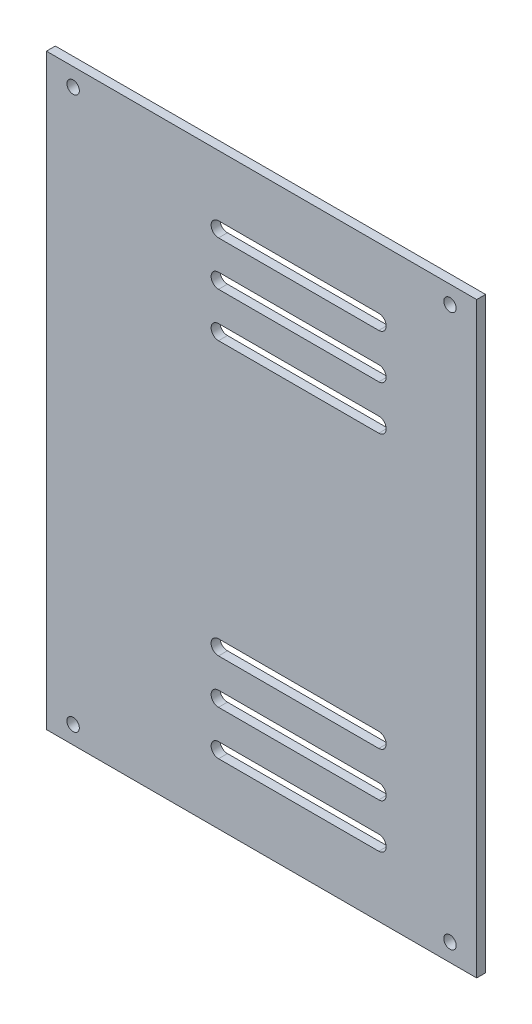
ISO-10303-21;
HEADER;
FILE_DESCRIPTION(('STEP AP214'),'2;1');
FILE_NAME('part.step','',(''),(''),'','','');
FILE_SCHEMA(('AUTOMOTIVE_DESIGN { 1 0 10303 214 1 1 1 1 }'));
ENDSEC;
DATA;
#1=APPLICATION_CONTEXT('core data for automotive mechanical design processes');
#2=APPLICATION_PROTOCOL_DEFINITION('international standard','automotive_design',2000,#1);
#3=PRODUCT_CONTEXT('',#1,'mechanical');
#4=PRODUCT('Part','Part','',(#3));
#5=PRODUCT_RELATED_PRODUCT_CATEGORY('part','',(#4));
#6=PRODUCT_DEFINITION_FORMATION('','',#4);
#7=PRODUCT_DEFINITION_CONTEXT('part definition',#1,'design');
#8=PRODUCT_DEFINITION('design','',#6,#7);
#9=PRODUCT_DEFINITION_SHAPE('','',#8);
#10=(LENGTH_UNIT() NAMED_UNIT(*) SI_UNIT(.MILLI.,.METRE.));
#11=(NAMED_UNIT(*) PLANE_ANGLE_UNIT() SI_UNIT($,.RADIAN.));
#12=(NAMED_UNIT(*) SI_UNIT($,.STERADIAN.) SOLID_ANGLE_UNIT());
#13=UNCERTAINTY_MEASURE_WITH_UNIT(LENGTH_MEASURE(1.E-05),#10,'distance_accuracy_value','');
#14=(GEOMETRIC_REPRESENTATION_CONTEXT(3) GLOBAL_UNCERTAINTY_ASSIGNED_CONTEXT((#13)) GLOBAL_UNIT_ASSIGNED_CONTEXT((#10,
#11,#12)) REPRESENTATION_CONTEXT('',''));
#15=CARTESIAN_POINT('',(0.,0.,0.));
#16=DIRECTION('',(0.,0.,1.));
#17=DIRECTION('',(1.,0.,0.));
#18=AXIS2_PLACEMENT_3D('',#15,#16,#17);
#19=CARTESIAN_POINT('',(0.,0.,3.));
#20=DIRECTION('',(0.,0.,1.));
#21=DIRECTION('',(1.,0.,0.));
#22=AXIS2_PLACEMENT_3D('',#19,#20,#21);
#23=PLANE('',#22);
#24=CARTESIAN_POINT('',(45.,-93.,3.));
#25=DIRECTION('',(0.,0.,1.));
#26=DIRECTION('',(1.,0.,0.));
#27=AXIS2_PLACEMENT_3D('',#24,#25,#26);
#28=CIRCLE('',#27,2.1);
#29=CARTESIAN_POINT('',(47.1,-93.,3.));
#30=VERTEX_POINT('',#29);
#31=EDGE_CURVE('E502',#30,#30,#28,.T.);
#32=ORIENTED_EDGE('',*,*,#31,.F.);
#33=EDGE_LOOP('',(#32));
#34=FACE_BOUND('',#33,.T.);
#35=CARTESIAN_POINT('',(-82.,-93.,3.));
#36=DIRECTION('',(0.,0.,1.));
#37=DIRECTION('',(1.,0.,0.));
#38=AXIS2_PLACEMENT_3D('',#35,#36,#37);
#39=CIRCLE('',#38,2.1);
#40=CARTESIAN_POINT('',(-79.9,-93.,3.));
#41=VERTEX_POINT('',#40);
#42=EDGE_CURVE('E518',#41,#41,#39,.T.);
#43=ORIENTED_EDGE('',*,*,#42,.F.);
#44=EDGE_LOOP('',(#43));
#45=FACE_BOUND('',#44,.T.);
#46=DIRECTION('',(0.,-1.,0.));
#47=VECTOR('',#46,1.);
#48=CARTESIAN_POINT('',(-91.,99.,3.));
#49=LINE('',#48,#47);
#50=CARTESIAN_POINT('',(-91.,99.,3.));
#51=VERTEX_POINT('',#50);
#52=CARTESIAN_POINT('',(-91.,-99.,3.));
#53=VERTEX_POINT('',#52);
#54=EDGE_CURVE('E526',#51,#53,#49,.T.);
#55=ORIENTED_EDGE('',*,*,#54,.T.);
#56=DIRECTION('',(1.,0.,0.));
#57=VECTOR('',#56,1.);
#58=CARTESIAN_POINT('',(-91.,-99.,3.));
#59=LINE('',#58,#57);
#60=CARTESIAN_POINT('',(54.,-99.,3.));
#61=VERTEX_POINT('',#60);
#62=EDGE_CURVE('E530',#53,#61,#59,.T.);
#63=ORIENTED_EDGE('',*,*,#62,.T.);
#64=DIRECTION('',(0.,1.,0.));
#65=VECTOR('',#64,1.);
#66=CARTESIAN_POINT('',(54.,-99.,3.));
#67=LINE('',#66,#65);
#68=CARTESIAN_POINT('',(54.,99.,3.));
#69=VERTEX_POINT('',#68);
#70=EDGE_CURVE('E534',#61,#69,#67,.T.);
#71=ORIENTED_EDGE('',*,*,#70,.T.);
#72=DIRECTION('',(-1.,0.,0.));
#73=VECTOR('',#72,1.);
#74=CARTESIAN_POINT('',(54.,99.,3.));
#75=LINE('',#74,#73);
#76=EDGE_CURVE('E537',#69,#51,#75,.T.);
#77=ORIENTED_EDGE('',*,*,#76,.T.);
#78=EDGE_LOOP('',(#55,#63,#71,#77));
#79=FACE_BOUND('',#78,.T.);
#80=CARTESIAN_POINT('',(-82.,93.,3.));
#81=DIRECTION('',(0.,0.,1.));
#82=DIRECTION('',(1.,0.,0.));
#83=AXIS2_PLACEMENT_3D('',#80,#81,#82);
#84=CIRCLE('',#83,2.1);
#85=CARTESIAN_POINT('',(-79.9,93.,3.));
#86=VERTEX_POINT('',#85);
#87=EDGE_CURVE('E510',#86,#86,#84,.T.);
#88=ORIENTED_EDGE('',*,*,#87,.F.);
#89=EDGE_LOOP('',(#88));
#90=FACE_BOUND('',#89,.T.);
#91=CARTESIAN_POINT('',(45.,93.,3.));
#92=DIRECTION('',(0.,0.,1.));
#93=DIRECTION('',(1.,0.,0.));
#94=AXIS2_PLACEMENT_3D('',#91,#92,#93);
#95=CIRCLE('',#94,2.1);
#96=CARTESIAN_POINT('',(47.1,93.,3.));
#97=VERTEX_POINT('',#96);
#98=EDGE_CURVE('E494',#97,#97,#95,.T.);
#99=ORIENTED_EDGE('',*,*,#98,.F.);
#100=EDGE_LOOP('',(#99));
#101=FACE_BOUND('',#100,.T.);
#102=DIRECTION('',(1.,0.,0.));
#103=VECTOR('',#102,1.);
#104=CARTESIAN_POINT('',(-33.,-78.5,3.));
#105=LINE('',#104,#103);
#106=CARTESIAN_POINT('',(-33.,-78.5,3.));
#107=VERTEX_POINT('',#106);
#108=CARTESIAN_POINT('',(21.,-78.5,3.));
#109=VERTEX_POINT('',#108);
#110=EDGE_CURVE('E454',#107,#109,#105,.T.);
#111=ORIENTED_EDGE('',*,*,#110,.F.);
#112=CARTESIAN_POINT('',(-33.,-76.,3.));
#113=DIRECTION('',(0.,0.,1.));
#114=DIRECTION('',(1.,0.,0.));
#115=AXIS2_PLACEMENT_3D('',#112,#113,#114);
#116=CIRCLE('',#115,2.5);
#117=CARTESIAN_POINT('',(-33.,-73.5,3.));
#118=VERTEX_POINT('',#117);
#119=EDGE_CURVE('E451',#118,#107,#116,.T.);
#120=ORIENTED_EDGE('',*,*,#119,.F.);
#121=DIRECTION('',(-1.,0.,0.));
#122=VECTOR('',#121,1.);
#123=CARTESIAN_POINT('',(21.,-73.5,3.));
#124=LINE('',#123,#122);
#125=CARTESIAN_POINT('',(21.,-73.5,3.));
#126=VERTEX_POINT('',#125);
#127=EDGE_CURVE('E462',#126,#118,#124,.T.);
#128=ORIENTED_EDGE('',*,*,#127,.F.);
#129=CARTESIAN_POINT('',(21.,-76.,3.));
#130=DIRECTION('',(0.,0.,1.));
#131=DIRECTION('',(1.,0.,0.));
#132=AXIS2_PLACEMENT_3D('',#129,#130,#131);
#133=CIRCLE('',#132,2.5);
#134=EDGE_CURVE('E458',#109,#126,#133,.T.);
#135=ORIENTED_EDGE('',*,*,#134,.F.);
#136=EDGE_LOOP('',(#111,#120,#128,#135));
#137=FACE_BOUND('',#136,.T.);
#138=DIRECTION('',(1.,0.,0.));
#139=VECTOR('',#138,1.);
#140=CARTESIAN_POINT('',(-33.,-63.5,3.));
#141=LINE('',#140,#139);
#142=CARTESIAN_POINT('',(-33.,-63.5,3.));
#143=VERTEX_POINT('',#142);
#144=CARTESIAN_POINT('',(21.,-63.5,3.));
#145=VERTEX_POINT('',#144);
#146=EDGE_CURVE('E411',#143,#145,#141,.T.);
#147=ORIENTED_EDGE('',*,*,#146,.F.);
#148=CARTESIAN_POINT('',(-33.,-61.,3.));
#149=DIRECTION('',(0.,0.,1.));
#150=DIRECTION('',(1.,0.,0.));
#151=AXIS2_PLACEMENT_3D('',#148,#149,#150);
#152=CIRCLE('',#151,2.5);
#153=CARTESIAN_POINT('',(-33.,-58.5,3.));
#154=VERTEX_POINT('',#153);
#155=EDGE_CURVE('E408',#154,#143,#152,.T.);
#156=ORIENTED_EDGE('',*,*,#155,.F.);
#157=DIRECTION('',(-1.,0.,0.));
#158=VECTOR('',#157,1.);
#159=CARTESIAN_POINT('',(21.,-58.5,3.));
#160=LINE('',#159,#158);
#161=CARTESIAN_POINT('',(21.,-58.5,3.));
#162=VERTEX_POINT('',#161);
#163=EDGE_CURVE('E419',#162,#154,#160,.T.);
#164=ORIENTED_EDGE('',*,*,#163,.F.);
#165=CARTESIAN_POINT('',(21.,-61.,3.));
#166=DIRECTION('',(0.,0.,1.));
#167=DIRECTION('',(1.,0.,0.));
#168=AXIS2_PLACEMENT_3D('',#165,#166,#167);
#169=CIRCLE('',#168,2.5);
#170=EDGE_CURVE('E415',#145,#162,#169,.T.);
#171=ORIENTED_EDGE('',*,*,#170,.F.);
#172=EDGE_LOOP('',(#147,#156,#164,#171));
#173=FACE_BOUND('',#172,.T.);
#174=DIRECTION('',(1.,0.,0.));
#175=VECTOR('',#174,1.);
#176=CARTESIAN_POINT('',(-33.,-48.5,3.));
#177=LINE('',#176,#175);
#178=CARTESIAN_POINT('',(-33.,-48.5,3.));
#179=VERTEX_POINT('',#178);
#180=CARTESIAN_POINT('',(21.,-48.5,3.));
#181=VERTEX_POINT('',#180);
#182=EDGE_CURVE('E368',#179,#181,#177,.T.);
#183=ORIENTED_EDGE('',*,*,#182,.F.);
#184=CARTESIAN_POINT('',(-33.,-46.,3.));
#185=DIRECTION('',(0.,0.,1.));
#186=DIRECTION('',(1.,0.,0.));
#187=AXIS2_PLACEMENT_3D('',#184,#185,#186);
#188=CIRCLE('',#187,2.5);
#189=CARTESIAN_POINT('',(-33.,-43.5,3.));
#190=VERTEX_POINT('',#189);
#191=EDGE_CURVE('E365',#190,#179,#188,.T.);
#192=ORIENTED_EDGE('',*,*,#191,.F.);
#193=DIRECTION('',(-1.,0.,0.));
#194=VECTOR('',#193,1.);
#195=CARTESIAN_POINT('',(21.,-43.5,3.));
#196=LINE('',#195,#194);
#197=CARTESIAN_POINT('',(21.,-43.5,3.));
#198=VERTEX_POINT('',#197);
#199=EDGE_CURVE('E376',#198,#190,#196,.T.);
#200=ORIENTED_EDGE('',*,*,#199,.F.);
#201=CARTESIAN_POINT('',(21.,-46.,3.));
#202=DIRECTION('',(0.,0.,1.));
#203=DIRECTION('',(1.,0.,0.));
#204=AXIS2_PLACEMENT_3D('',#201,#202,#203);
#205=CIRCLE('',#204,2.5);
#206=EDGE_CURVE('E372',#181,#198,#205,.T.);
#207=ORIENTED_EDGE('',*,*,#206,.F.);
#208=EDGE_LOOP('',(#183,#192,#200,#207));
#209=FACE_BOUND('',#208,.T.);
#210=DIRECTION('',(1.,0.,0.));
#211=VECTOR('',#210,1.);
#212=CARTESIAN_POINT('',(-33.,43.5,3.));
#213=LINE('',#212,#211);
#214=CARTESIAN_POINT('',(-33.,43.5,3.));
#215=VERTEX_POINT('',#214);
#216=CARTESIAN_POINT('',(21.,43.5,3.));
#217=VERTEX_POINT('',#216);
#218=EDGE_CURVE('E325',#215,#217,#213,.T.);
#219=ORIENTED_EDGE('',*,*,#218,.F.);
#220=CARTESIAN_POINT('',(-33.,46.,3.));
#221=DIRECTION('',(0.,0.,1.));
#222=DIRECTION('',(1.,0.,0.));
#223=AXIS2_PLACEMENT_3D('',#220,#221,#222);
#224=CIRCLE('',#223,2.5);
#225=CARTESIAN_POINT('',(-33.,48.5,3.));
#226=VERTEX_POINT('',#225);
#227=EDGE_CURVE('E322',#226,#215,#224,.T.);
#228=ORIENTED_EDGE('',*,*,#227,.F.);
#229=DIRECTION('',(-1.,0.,0.));
#230=VECTOR('',#229,1.);
#231=CARTESIAN_POINT('',(21.,48.5,3.));
#232=LINE('',#231,#230);
#233=CARTESIAN_POINT('',(21.,48.5,3.));
#234=VERTEX_POINT('',#233);
#235=EDGE_CURVE('E333',#234,#226,#232,.T.);
#236=ORIENTED_EDGE('',*,*,#235,.F.);
#237=CARTESIAN_POINT('',(21.,46.,3.));
#238=DIRECTION('',(0.,0.,1.));
#239=DIRECTION('',(1.,0.,0.));
#240=AXIS2_PLACEMENT_3D('',#237,#238,#239);
#241=CIRCLE('',#240,2.5);
#242=EDGE_CURVE('E329',#217,#234,#241,.T.);
#243=ORIENTED_EDGE('',*,*,#242,.F.);
#244=EDGE_LOOP('',(#219,#228,#236,#243));
#245=FACE_BOUND('',#244,.T.);
#246=DIRECTION('',(1.,0.,0.));
#247=VECTOR('',#246,1.);
#248=CARTESIAN_POINT('',(-33.,58.5,3.));
#249=LINE('',#248,#247);
#250=CARTESIAN_POINT('',(-33.,58.5,3.));
#251=VERTEX_POINT('',#250);
#252=CARTESIAN_POINT('',(21.,58.5,3.));
#253=VERTEX_POINT('',#252);
#254=EDGE_CURVE('E282',#251,#253,#249,.T.);
#255=ORIENTED_EDGE('',*,*,#254,.F.);
#256=CARTESIAN_POINT('',(-33.,61.,3.));
#257=DIRECTION('',(0.,0.,1.));
#258=DIRECTION('',(1.,0.,0.));
#259=AXIS2_PLACEMENT_3D('',#256,#257,#258);
#260=CIRCLE('',#259,2.5);
#261=CARTESIAN_POINT('',(-33.,63.5,3.));
#262=VERTEX_POINT('',#261);
#263=EDGE_CURVE('E279',#262,#251,#260,.T.);
#264=ORIENTED_EDGE('',*,*,#263,.F.);
#265=DIRECTION('',(-1.,0.,0.));
#266=VECTOR('',#265,1.);
#267=CARTESIAN_POINT('',(21.,63.5,3.));
#268=LINE('',#267,#266);
#269=CARTESIAN_POINT('',(21.,63.5,3.));
#270=VERTEX_POINT('',#269);
#271=EDGE_CURVE('E290',#270,#262,#268,.T.);
#272=ORIENTED_EDGE('',*,*,#271,.F.);
#273=CARTESIAN_POINT('',(21.,61.,3.));
#274=DIRECTION('',(0.,0.,1.));
#275=DIRECTION('',(1.,0.,0.));
#276=AXIS2_PLACEMENT_3D('',#273,#274,#275);
#277=CIRCLE('',#276,2.5);
#278=EDGE_CURVE('E286',#253,#270,#277,.T.);
#279=ORIENTED_EDGE('',*,*,#278,.F.);
#280=EDGE_LOOP('',(#255,#264,#272,#279));
#281=FACE_BOUND('',#280,.T.);
#282=DIRECTION('',(1.,0.,0.));
#283=VECTOR('',#282,1.);
#284=CARTESIAN_POINT('',(-33.,73.5,3.));
#285=LINE('',#284,#283);
#286=CARTESIAN_POINT('',(-33.,73.5,3.));
#287=VERTEX_POINT('',#286);
#288=CARTESIAN_POINT('',(21.,73.5,3.));
#289=VERTEX_POINT('',#288);
#290=EDGE_CURVE('E240',#287,#289,#285,.T.);
#291=ORIENTED_EDGE('',*,*,#290,.F.);
#292=CARTESIAN_POINT('',(-33.,76.,3.));
#293=DIRECTION('',(0.,0.,1.));
#294=DIRECTION('',(1.,0.,0.));
#295=AXIS2_PLACEMENT_3D('',#292,#293,#294);
#296=CIRCLE('',#295,2.5);
#297=CARTESIAN_POINT('',(-33.,78.5,3.));
#298=VERTEX_POINT('',#297);
#299=EDGE_CURVE('E231',#298,#287,#296,.T.);
#300=ORIENTED_EDGE('',*,*,#299,.F.);
#301=DIRECTION('',(-1.,0.,0.));
#302=VECTOR('',#301,1.);
#303=CARTESIAN_POINT('',(21.,78.5,3.));
#304=LINE('',#303,#302);
#305=CARTESIAN_POINT('',(21.,78.5,3.));
#306=VERTEX_POINT('',#305);
#307=EDGE_CURVE('E258',#306,#298,#304,.T.);
#308=ORIENTED_EDGE('',*,*,#307,.F.);
#309=CARTESIAN_POINT('',(21.,76.,3.));
#310=DIRECTION('',(0.,0.,1.));
#311=DIRECTION('',(1.,0.,0.));
#312=AXIS2_PLACEMENT_3D('',#309,#310,#311);
#313=CIRCLE('',#312,2.5);
#314=EDGE_CURVE('E253',#289,#306,#313,.T.);
#315=ORIENTED_EDGE('',*,*,#314,.F.);
#316=EDGE_LOOP('',(#291,#300,#308,#315));
#317=FACE_BOUND('',#316,.T.);
#318=ADVANCED_FACE('F45',(#34,#45,#79,#90,#101,#137,#173,#209,#245,#281,#317),#23,.T.);
#319=CARTESIAN_POINT('',(0.,0.,0.));
#320=DIRECTION('',(0.,0.,1.));
#321=DIRECTION('',(1.,0.,0.));
#322=AXIS2_PLACEMENT_3D('',#319,#320,#321);
#323=PLANE('',#322);
#324=CARTESIAN_POINT('',(-33.,61.,0.));
#325=DIRECTION('',(0.,0.,1.));
#326=DIRECTION('',(1.,0.,0.));
#327=AXIS2_PLACEMENT_3D('',#324,#325,#326);
#328=CIRCLE('',#327,2.5);
#329=CARTESIAN_POINT('',(-33.,63.5,0.));
#330=VERTEX_POINT('',#329);
#331=CARTESIAN_POINT('',(-33.,58.5,0.));
#332=VERTEX_POINT('',#331);
#333=EDGE_CURVE('E249',#330,#332,#328,.T.);
#334=ORIENTED_EDGE('',*,*,#333,.T.);
#335=DIRECTION('',(1.,0.,0.));
#336=VECTOR('',#335,1.);
#337=CARTESIAN_POINT('',(-33.,58.5,0.));
#338=LINE('',#337,#336);
#339=CARTESIAN_POINT('',(21.,58.5,0.));
#340=VERTEX_POINT('',#339);
#341=EDGE_CURVE('E297',#332,#340,#338,.T.);
#342=ORIENTED_EDGE('',*,*,#341,.T.);
#343=CARTESIAN_POINT('',(21.,61.,0.));
#344=DIRECTION('',(0.,0.,1.));
#345=DIRECTION('',(1.,0.,0.));
#346=AXIS2_PLACEMENT_3D('',#343,#344,#345);
#347=CIRCLE('',#346,2.5);
#348=CARTESIAN_POINT('',(21.,63.5,0.));
#349=VERTEX_POINT('',#348);
#350=EDGE_CURVE('E301',#340,#349,#347,.T.);
#351=ORIENTED_EDGE('',*,*,#350,.T.);
#352=DIRECTION('',(-1.,0.,0.));
#353=VECTOR('',#352,1.);
#354=CARTESIAN_POINT('',(21.,63.5,0.));
#355=LINE('',#354,#353);
#356=EDGE_CURVE('E283',#349,#330,#355,.T.);
#357=ORIENTED_EDGE('',*,*,#356,.T.);
#358=EDGE_LOOP('',(#334,#342,#351,#357));
#359=FACE_BOUND('',#358,.T.);
#360=CARTESIAN_POINT('',(-33.,-46.,0.));
#361=DIRECTION('',(0.,0.,1.));
#362=DIRECTION('',(1.,0.,0.));
#363=AXIS2_PLACEMENT_3D('',#360,#361,#362);
#364=CIRCLE('',#363,2.5);
#365=CARTESIAN_POINT('',(-33.,-43.5,0.));
#366=VERTEX_POINT('',#365);
#367=CARTESIAN_POINT('',(-33.,-48.5,0.));
#368=VERTEX_POINT('',#367);
#369=EDGE_CURVE('E364',#366,#368,#364,.T.);
#370=ORIENTED_EDGE('',*,*,#369,.T.);
#371=DIRECTION('',(1.,0.,0.));
#372=VECTOR('',#371,1.);
#373=CARTESIAN_POINT('',(-33.,-48.5,0.));
#374=LINE('',#373,#372);
#375=CARTESIAN_POINT('',(21.,-48.5,0.));
#376=VERTEX_POINT('',#375);
#377=EDGE_CURVE('E383',#368,#376,#374,.T.);
#378=ORIENTED_EDGE('',*,*,#377,.T.);
#379=CARTESIAN_POINT('',(21.,-46.,0.));
#380=DIRECTION('',(0.,0.,1.));
#381=DIRECTION('',(1.,0.,0.));
#382=AXIS2_PLACEMENT_3D('',#379,#380,#381);
#383=CIRCLE('',#382,2.5);
#384=CARTESIAN_POINT('',(21.,-43.5,0.));
#385=VERTEX_POINT('',#384);
#386=EDGE_CURVE('E387',#376,#385,#383,.T.);
#387=ORIENTED_EDGE('',*,*,#386,.T.);
#388=DIRECTION('',(-1.,0.,0.));
#389=VECTOR('',#388,1.);
#390=CARTESIAN_POINT('',(21.,-43.5,0.));
#391=LINE('',#390,#389);
#392=EDGE_CURVE('E369',#385,#366,#391,.T.);
#393=ORIENTED_EDGE('',*,*,#392,.T.);
#394=EDGE_LOOP('',(#370,#378,#387,#393));
#395=FACE_BOUND('',#394,.T.);
#396=CARTESIAN_POINT('',(-33.,-76.,0.));
#397=DIRECTION('',(0.,0.,1.));
#398=DIRECTION('',(1.,0.,0.));
#399=AXIS2_PLACEMENT_3D('',#396,#397,#398);
#400=CIRCLE('',#399,2.5);
#401=CARTESIAN_POINT('',(-33.,-73.5,0.));
#402=VERTEX_POINT('',#401);
#403=CARTESIAN_POINT('',(-33.,-78.5,0.));
#404=VERTEX_POINT('',#403);
#405=EDGE_CURVE('E450',#402,#404,#400,.T.);
#406=ORIENTED_EDGE('',*,*,#405,.T.);
#407=DIRECTION('',(1.,0.,0.));
#408=VECTOR('',#407,1.);
#409=CARTESIAN_POINT('',(-33.,-78.5,0.));
#410=LINE('',#409,#408);
#411=CARTESIAN_POINT('',(21.,-78.5,0.));
#412=VERTEX_POINT('',#411);
#413=EDGE_CURVE('E469',#404,#412,#410,.T.);
#414=ORIENTED_EDGE('',*,*,#413,.T.);
#415=CARTESIAN_POINT('',(21.,-76.,0.));
#416=DIRECTION('',(0.,0.,1.));
#417=DIRECTION('',(1.,0.,0.));
#418=AXIS2_PLACEMENT_3D('',#415,#416,#417);
#419=CIRCLE('',#418,2.5);
#420=CARTESIAN_POINT('',(21.,-73.5,0.));
#421=VERTEX_POINT('',#420);
#422=EDGE_CURVE('E473',#412,#421,#419,.T.);
#423=ORIENTED_EDGE('',*,*,#422,.T.);
#424=DIRECTION('',(-1.,0.,0.));
#425=VECTOR('',#424,1.);
#426=CARTESIAN_POINT('',(21.,-73.5,0.));
#427=LINE('',#426,#425);
#428=EDGE_CURVE('E455',#421,#402,#427,.T.);
#429=ORIENTED_EDGE('',*,*,#428,.T.);
#430=EDGE_LOOP('',(#406,#414,#423,#429));
#431=FACE_BOUND('',#430,.T.);
#432=DIRECTION('',(0.,-1.,0.));
#433=VECTOR('',#432,1.);
#434=CARTESIAN_POINT('',(-91.,99.,0.));
#435=LINE('',#434,#433);
#436=CARTESIAN_POINT('',(-91.,99.,0.));
#437=VERTEX_POINT('',#436);
#438=CARTESIAN_POINT('',(-91.,-99.,0.));
#439=VERTEX_POINT('',#438);
#440=EDGE_CURVE('E522',#437,#439,#435,.T.);
#441=ORIENTED_EDGE('',*,*,#440,.F.);
#442=DIRECTION('',(-1.,0.,0.));
#443=VECTOR('',#442,1.);
#444=CARTESIAN_POINT('',(54.,99.,0.));
#445=LINE('',#444,#443);
#446=CARTESIAN_POINT('',(54.,99.,0.));
#447=VERTEX_POINT('',#446);
#448=EDGE_CURVE('E531',#447,#437,#445,.T.);
#449=ORIENTED_EDGE('',*,*,#448,.F.);
#450=DIRECTION('',(0.,1.,0.));
#451=VECTOR('',#450,1.);
#452=CARTESIAN_POINT('',(54.,-99.,0.));
#453=LINE('',#452,#451);
#454=CARTESIAN_POINT('',(54.,-99.,0.));
#455=VERTEX_POINT('',#454);
#456=EDGE_CURVE('E547',#455,#447,#453,.T.);
#457=ORIENTED_EDGE('',*,*,#456,.F.);
#458=DIRECTION('',(1.,0.,0.));
#459=VECTOR('',#458,1.);
#460=CARTESIAN_POINT('',(-91.,-99.,0.));
#461=LINE('',#460,#459);
#462=EDGE_CURVE('E544',#439,#455,#461,.T.);
#463=ORIENTED_EDGE('',*,*,#462,.F.);
#464=EDGE_LOOP('',(#441,#449,#457,#463));
#465=FACE_BOUND('',#464,.T.);
#466=CARTESIAN_POINT('',(-82.,-93.,0.));
#467=DIRECTION('',(0.,0.,1.));
#468=DIRECTION('',(1.,0.,0.));
#469=AXIS2_PLACEMENT_3D('',#466,#467,#468);
#470=CIRCLE('',#469,2.1);
#471=CARTESIAN_POINT('',(-79.9,-93.,0.));
#472=VERTEX_POINT('',#471);
#473=EDGE_CURVE('E514',#472,#472,#470,.T.);
#474=ORIENTED_EDGE('',*,*,#473,.T.);
#475=EDGE_LOOP('',(#474));
#476=FACE_BOUND('',#475,.T.);
#477=CARTESIAN_POINT('',(-82.,93.,0.));
#478=DIRECTION('',(0.,0.,1.));
#479=DIRECTION('',(1.,0.,0.));
#480=AXIS2_PLACEMENT_3D('',#477,#478,#479);
#481=CIRCLE('',#480,2.1);
#482=CARTESIAN_POINT('',(-79.9,93.,0.));
#483=VERTEX_POINT('',#482);
#484=EDGE_CURVE('E506',#483,#483,#481,.T.);
#485=ORIENTED_EDGE('',*,*,#484,.T.);
#486=EDGE_LOOP('',(#485));
#487=FACE_BOUND('',#486,.T.);
#488=CARTESIAN_POINT('',(45.,-93.,0.));
#489=DIRECTION('',(0.,0.,1.));
#490=DIRECTION('',(1.,0.,0.));
#491=AXIS2_PLACEMENT_3D('',#488,#489,#490);
#492=CIRCLE('',#491,2.1);
#493=CARTESIAN_POINT('',(47.1,-93.,0.));
#494=VERTEX_POINT('',#493);
#495=EDGE_CURVE('E498',#494,#494,#492,.T.);
#496=ORIENTED_EDGE('',*,*,#495,.T.);
#497=EDGE_LOOP('',(#496));
#498=FACE_BOUND('',#497,.T.);
#499=CARTESIAN_POINT('',(45.,93.,0.));
#500=DIRECTION('',(0.,0.,1.));
#501=DIRECTION('',(1.,0.,0.));
#502=AXIS2_PLACEMENT_3D('',#499,#500,#501);
#503=CIRCLE('',#502,2.1);
#504=CARTESIAN_POINT('',(47.1,93.,0.));
#505=VERTEX_POINT('',#504);
#506=EDGE_CURVE('E493',#505,#505,#503,.T.);
#507=ORIENTED_EDGE('',*,*,#506,.T.);
#508=EDGE_LOOP('',(#507));
#509=FACE_BOUND('',#508,.T.);
#510=CARTESIAN_POINT('',(-33.,-61.,0.));
#511=DIRECTION('',(0.,0.,1.));
#512=DIRECTION('',(1.,0.,0.));
#513=AXIS2_PLACEMENT_3D('',#510,#511,#512);
#514=CIRCLE('',#513,2.5);
#515=CARTESIAN_POINT('',(-33.,-58.5,0.));
#516=VERTEX_POINT('',#515);
#517=CARTESIAN_POINT('',(-33.,-63.5,0.));
#518=VERTEX_POINT('',#517);
#519=EDGE_CURVE('E407',#516,#518,#514,.T.);
#520=ORIENTED_EDGE('',*,*,#519,.T.);
#521=DIRECTION('',(1.,0.,0.));
#522=VECTOR('',#521,1.);
#523=CARTESIAN_POINT('',(-33.,-63.5,0.));
#524=LINE('',#523,#522);
#525=CARTESIAN_POINT('',(21.,-63.5,0.));
#526=VERTEX_POINT('',#525);
#527=EDGE_CURVE('E426',#518,#526,#524,.T.);
#528=ORIENTED_EDGE('',*,*,#527,.T.);
#529=CARTESIAN_POINT('',(21.,-61.,0.));
#530=DIRECTION('',(0.,0.,1.));
#531=DIRECTION('',(1.,0.,0.));
#532=AXIS2_PLACEMENT_3D('',#529,#530,#531);
#533=CIRCLE('',#532,2.5);
#534=CARTESIAN_POINT('',(21.,-58.5,0.));
#535=VERTEX_POINT('',#534);
#536=EDGE_CURVE('E430',#526,#535,#533,.T.);
#537=ORIENTED_EDGE('',*,*,#536,.T.);
#538=DIRECTION('',(-1.,0.,0.));
#539=VECTOR('',#538,1.);
#540=CARTESIAN_POINT('',(21.,-58.5,0.));
#541=LINE('',#540,#539);
#542=EDGE_CURVE('E412',#535,#516,#541,.T.);
#543=ORIENTED_EDGE('',*,*,#542,.T.);
#544=EDGE_LOOP('',(#520,#528,#537,#543));
#545=FACE_BOUND('',#544,.T.);
#546=CARTESIAN_POINT('',(-33.,46.,0.));
#547=DIRECTION('',(0.,0.,1.));
#548=DIRECTION('',(1.,0.,0.));
#549=AXIS2_PLACEMENT_3D('',#546,#547,#548);
#550=CIRCLE('',#549,2.5);
#551=CARTESIAN_POINT('',(-33.,48.5,0.));
#552=VERTEX_POINT('',#551);
#553=CARTESIAN_POINT('',(-33.,43.5,0.));
#554=VERTEX_POINT('',#553);
#555=EDGE_CURVE('E321',#552,#554,#550,.T.);
#556=ORIENTED_EDGE('',*,*,#555,.T.);
#557=DIRECTION('',(1.,0.,0.));
#558=VECTOR('',#557,1.);
#559=CARTESIAN_POINT('',(-33.,43.5,0.));
#560=LINE('',#559,#558);
#561=CARTESIAN_POINT('',(21.,43.5,0.));
#562=VERTEX_POINT('',#561);
#563=EDGE_CURVE('E340',#554,#562,#560,.T.);
#564=ORIENTED_EDGE('',*,*,#563,.T.);
#565=CARTESIAN_POINT('',(21.,46.,0.));
#566=DIRECTION('',(0.,0.,1.));
#567=DIRECTION('',(1.,0.,0.));
#568=AXIS2_PLACEMENT_3D('',#565,#566,#567);
#569=CIRCLE('',#568,2.5);
#570=CARTESIAN_POINT('',(21.,48.5,0.));
#571=VERTEX_POINT('',#570);
#572=EDGE_CURVE('E344',#562,#571,#569,.T.);
#573=ORIENTED_EDGE('',*,*,#572,.T.);
#574=DIRECTION('',(-1.,0.,0.));
#575=VECTOR('',#574,1.);
#576=CARTESIAN_POINT('',(21.,48.5,0.));
#577=LINE('',#576,#575);
#578=EDGE_CURVE('E326',#571,#552,#577,.T.);
#579=ORIENTED_EDGE('',*,*,#578,.T.);
#580=EDGE_LOOP('',(#556,#564,#573,#579));
#581=FACE_BOUND('',#580,.T.);
#582=CARTESIAN_POINT('',(-33.,76.,0.));
#583=DIRECTION('',(0.,0.,1.));
#584=DIRECTION('',(1.,0.,0.));
#585=AXIS2_PLACEMENT_3D('',#582,#583,#584);
#586=CIRCLE('',#585,2.5);
#587=CARTESIAN_POINT('',(-33.,78.5,0.));
#588=VERTEX_POINT('',#587);
#589=CARTESIAN_POINT('',(-33.,73.5,0.));
#590=VERTEX_POINT('',#589);
#591=EDGE_CURVE('E69',#588,#590,#586,.T.);
#592=ORIENTED_EDGE('',*,*,#591,.T.);
#593=DIRECTION('',(1.,0.,0.));
#594=VECTOR('',#593,1.);
#595=CARTESIAN_POINT('',(-33.,73.5,0.));
#596=LINE('',#595,#594);
#597=CARTESIAN_POINT('',(21.,73.5,0.));
#598=VERTEX_POINT('',#597);
#599=EDGE_CURVE('E247',#590,#598,#596,.T.);
#600=ORIENTED_EDGE('',*,*,#599,.T.);
#601=CARTESIAN_POINT('',(21.,76.,0.));
#602=DIRECTION('',(0.,0.,1.));
#603=DIRECTION('',(1.,0.,0.));
#604=AXIS2_PLACEMENT_3D('',#601,#602,#603);
#605=CIRCLE('',#604,2.5);
#606=CARTESIAN_POINT('',(21.,78.5,0.));
#607=VERTEX_POINT('',#606);
#608=EDGE_CURVE('E267',#598,#607,#605,.T.);
#609=ORIENTED_EDGE('',*,*,#608,.T.);
#610=DIRECTION('',(-1.,0.,0.));
#611=VECTOR('',#610,1.);
#612=CARTESIAN_POINT('',(21.,78.5,0.));
#613=LINE('',#612,#611);
#614=EDGE_CURVE('E241',#607,#588,#613,.T.);
#615=ORIENTED_EDGE('',*,*,#614,.T.);
#616=EDGE_LOOP('',(#592,#600,#609,#615));
#617=FACE_BOUND('',#616,.T.);
#618=ADVANCED_FACE('F570',(#359,#395,#431,#465,#476,#487,#498,#509,#545,#581,#617),#323,.F.);
#619=CARTESIAN_POINT('',(-91.,99.,3.));
#620=DIRECTION('',(1.,0.,0.));
#621=DIRECTION('',(0.,0.,-1.));
#622=AXIS2_PLACEMENT_3D('',#619,#620,#621);
#623=PLANE('',#622);
#624=ORIENTED_EDGE('',*,*,#440,.T.);
#625=DIRECTION('',(0.,0.,-1.));
#626=VECTOR('',#625,1.);
#627=CARTESIAN_POINT('',(-91.,-99.,3.));
#628=LINE('',#627,#626);
#629=EDGE_CURVE('E11',#53,#439,#628,.T.);
#630=ORIENTED_EDGE('',*,*,#629,.F.);
#631=ORIENTED_EDGE('',*,*,#54,.F.);
#632=DIRECTION('',(0.,0.,-1.));
#633=VECTOR('',#632,1.);
#634=CARTESIAN_POINT('',(-91.,99.,3.));
#635=LINE('',#634,#633);
#636=EDGE_CURVE('E540',#51,#437,#635,.T.);
#637=ORIENTED_EDGE('',*,*,#636,.T.);
#638=EDGE_LOOP('',(#624,#630,#631,#637));
#639=FACE_BOUND('',#638,.T.);
#640=ADVANCED_FACE('F47',(#639),#623,.F.);
#641=CARTESIAN_POINT('',(-91.,-99.,3.));
#642=DIRECTION('',(0.,1.,0.));
#643=DIRECTION('',(0.,0.,1.));
#644=AXIS2_PLACEMENT_3D('',#641,#642,#643);
#645=PLANE('',#644);
#646=ORIENTED_EDGE('',*,*,#462,.T.);
#647=DIRECTION('',(0.,0.,-1.));
#648=VECTOR('',#647,1.);
#649=CARTESIAN_POINT('',(54.,-99.,3.));
#650=LINE('',#649,#648);
#651=EDGE_CURVE('E54',#61,#455,#650,.T.);
#652=ORIENTED_EDGE('',*,*,#651,.F.);
#653=ORIENTED_EDGE('',*,*,#62,.F.);
#654=ORIENTED_EDGE('',*,*,#629,.T.);
#655=EDGE_LOOP('',(#646,#652,#653,#654));
#656=FACE_BOUND('',#655,.T.);
#657=ADVANCED_FACE('F581',(#656),#645,.F.);
#658=CARTESIAN_POINT('',(54.,-99.,3.));
#659=DIRECTION('',(-1.,0.,0.));
#660=DIRECTION('',(0.,0.,1.));
#661=AXIS2_PLACEMENT_3D('',#658,#659,#660);
#662=PLANE('',#661);
#663=ORIENTED_EDGE('',*,*,#456,.T.);
#664=DIRECTION('',(0.,0.,-1.));
#665=VECTOR('',#664,1.);
#666=CARTESIAN_POINT('',(54.,99.,3.));
#667=LINE('',#666,#665);
#668=EDGE_CURVE('E555',#69,#447,#667,.T.);
#669=ORIENTED_EDGE('',*,*,#668,.F.);
#670=ORIENTED_EDGE('',*,*,#70,.F.);
#671=ORIENTED_EDGE('',*,*,#651,.T.);
#672=EDGE_LOOP('',(#663,#669,#670,#671));
#673=FACE_BOUND('',#672,.T.);
#674=ADVANCED_FACE('F564',(#673),#662,.F.);
#675=CARTESIAN_POINT('',(54.,99.,3.));
#676=DIRECTION('',(0.,-1.,0.));
#677=DIRECTION('',(0.,0.,-1.));
#678=AXIS2_PLACEMENT_3D('',#675,#676,#677);
#679=PLANE('',#678);
#680=ORIENTED_EDGE('',*,*,#448,.T.);
#681=ORIENTED_EDGE('',*,*,#636,.F.);
#682=ORIENTED_EDGE('',*,*,#76,.F.);
#683=ORIENTED_EDGE('',*,*,#668,.T.);
#684=EDGE_LOOP('',(#680,#681,#682,#683));
#685=FACE_BOUND('',#684,.T.);
#686=ADVANCED_FACE('F574',(#685),#679,.F.);
#687=CARTESIAN_POINT('',(-82.,-93.,3.));
#688=DIRECTION('',(0.,0.,-1.));
#689=DIRECTION('',(-1.,0.,0.));
#690=AXIS2_PLACEMENT_3D('',#687,#688,#689);
#691=CYLINDRICAL_SURFACE('',#690,2.1);
#692=ORIENTED_EDGE('',*,*,#42,.T.);
#693=EDGE_LOOP('',(#692));
#694=FACE_BOUND('',#693,.T.);
#695=ORIENTED_EDGE('',*,*,#473,.F.);
#696=EDGE_LOOP('',(#695));
#697=FACE_BOUND('',#696,.T.);
#698=ADVANCED_FACE('F597',(#694,#697),#691,.F.);
#699=CARTESIAN_POINT('',(-82.,93.,3.));
#700=DIRECTION('',(0.,0.,-1.));
#701=DIRECTION('',(-1.,0.,0.));
#702=AXIS2_PLACEMENT_3D('',#699,#700,#701);
#703=CYLINDRICAL_SURFACE('',#702,2.1);
#704=ORIENTED_EDGE('',*,*,#87,.T.);
#705=EDGE_LOOP('',(#704));
#706=FACE_BOUND('',#705,.T.);
#707=ORIENTED_EDGE('',*,*,#484,.F.);
#708=EDGE_LOOP('',(#707));
#709=FACE_BOUND('',#708,.T.);
#710=ADVANCED_FACE('F603',(#706,#709),#703,.F.);
#711=CARTESIAN_POINT('',(45.,-93.,3.));
#712=DIRECTION('',(0.,0.,-1.));
#713=DIRECTION('',(-1.,0.,0.));
#714=AXIS2_PLACEMENT_3D('',#711,#712,#713);
#715=CYLINDRICAL_SURFACE('',#714,2.1);
#716=ORIENTED_EDGE('',*,*,#31,.T.);
#717=EDGE_LOOP('',(#716));
#718=FACE_BOUND('',#717,.T.);
#719=ORIENTED_EDGE('',*,*,#495,.F.);
#720=EDGE_LOOP('',(#719));
#721=FACE_BOUND('',#720,.T.);
#722=ADVANCED_FACE('F607',(#718,#721),#715,.F.);
#723=CARTESIAN_POINT('',(45.,93.,3.));
#724=DIRECTION('',(0.,0.,-1.));
#725=DIRECTION('',(-1.,0.,0.));
#726=AXIS2_PLACEMENT_3D('',#723,#724,#725);
#727=CYLINDRICAL_SURFACE('',#726,2.1);
#728=ORIENTED_EDGE('',*,*,#98,.T.);
#729=EDGE_LOOP('',(#728));
#730=FACE_BOUND('',#729,.T.);
#731=ORIENTED_EDGE('',*,*,#506,.F.);
#732=EDGE_LOOP('',(#731));
#733=FACE_BOUND('',#732,.T.);
#734=ADVANCED_FACE('F714',(#730,#733),#727,.F.);
#735=CARTESIAN_POINT('',(-33.,-76.,3.));
#736=DIRECTION('',(0.,0.,-1.));
#737=DIRECTION('',(-1.,0.,0.));
#738=AXIS2_PLACEMENT_3D('',#735,#736,#737);
#739=CYLINDRICAL_SURFACE('',#738,2.5);
#740=ORIENTED_EDGE('',*,*,#405,.F.);
#741=DIRECTION('',(0.,0.,-1.));
#742=VECTOR('',#741,1.);
#743=CARTESIAN_POINT('',(-33.,-73.5,3.));
#744=LINE('',#743,#742);
#745=EDGE_CURVE('E465',#118,#402,#744,.T.);
#746=ORIENTED_EDGE('',*,*,#745,.F.);
#747=ORIENTED_EDGE('',*,*,#119,.T.);
#748=DIRECTION('',(0.,0.,-1.));
#749=VECTOR('',#748,1.);
#750=CARTESIAN_POINT('',(-33.,-78.5,3.));
#751=LINE('',#750,#749);
#752=EDGE_CURVE('E489',#107,#404,#751,.T.);
#753=ORIENTED_EDGE('',*,*,#752,.T.);
#754=EDGE_LOOP('',(#740,#746,#747,#753));
#755=FACE_BOUND('',#754,.T.);
#756=ADVANCED_FACE('F710',(#755),#739,.F.);
#757=CARTESIAN_POINT('',(-33.,-78.5,3.));
#758=DIRECTION('',(0.,1.,0.));
#759=DIRECTION('',(0.,0.,1.));
#760=AXIS2_PLACEMENT_3D('',#757,#758,#759);
#761=PLANE('',#760);
#762=ORIENTED_EDGE('',*,*,#413,.F.);
#763=ORIENTED_EDGE('',*,*,#752,.F.);
#764=ORIENTED_EDGE('',*,*,#110,.T.);
#765=DIRECTION('',(0.,0.,-1.));
#766=VECTOR('',#765,1.);
#767=CARTESIAN_POINT('',(21.,-78.5,3.));
#768=LINE('',#767,#766);
#769=EDGE_CURVE('E486',#109,#412,#768,.T.);
#770=ORIENTED_EDGE('',*,*,#769,.T.);
#771=EDGE_LOOP('',(#762,#763,#764,#770));
#772=FACE_BOUND('',#771,.T.);
#773=ADVANCED_FACE('F706',(#772),#761,.T.);
#774=CARTESIAN_POINT('',(21.,-76.,3.));
#775=DIRECTION('',(0.,0.,-1.));
#776=DIRECTION('',(-1.,0.,0.));
#777=AXIS2_PLACEMENT_3D('',#774,#775,#776);
#778=CYLINDRICAL_SURFACE('',#777,2.5);
#779=ORIENTED_EDGE('',*,*,#422,.F.);
#780=ORIENTED_EDGE('',*,*,#769,.F.);
#781=ORIENTED_EDGE('',*,*,#134,.T.);
#782=DIRECTION('',(0.,0.,-1.));
#783=VECTOR('',#782,1.);
#784=CARTESIAN_POINT('',(21.,-73.5,3.));
#785=LINE('',#784,#783);
#786=EDGE_CURVE('E483',#126,#421,#785,.T.);
#787=ORIENTED_EDGE('',*,*,#786,.T.);
#788=EDGE_LOOP('',(#779,#780,#781,#787));
#789=FACE_BOUND('',#788,.T.);
#790=ADVANCED_FACE('F702',(#789),#778,.F.);
#791=CARTESIAN_POINT('',(21.,-73.5,3.));
#792=DIRECTION('',(0.,-1.,0.));
#793=DIRECTION('',(0.,0.,-1.));
#794=AXIS2_PLACEMENT_3D('',#791,#792,#793);
#795=PLANE('',#794);
#796=ORIENTED_EDGE('',*,*,#428,.F.);
#797=ORIENTED_EDGE('',*,*,#786,.F.);
#798=ORIENTED_EDGE('',*,*,#127,.T.);
#799=ORIENTED_EDGE('',*,*,#745,.T.);
#800=EDGE_LOOP('',(#796,#797,#798,#799));
#801=FACE_BOUND('',#800,.T.);
#802=ADVANCED_FACE('F698',(#801),#795,.T.);
#803=CARTESIAN_POINT('',(-33.,-61.,3.));
#804=DIRECTION('',(0.,0.,-1.));
#805=DIRECTION('',(-1.,0.,0.));
#806=AXIS2_PLACEMENT_3D('',#803,#804,#805);
#807=CYLINDRICAL_SURFACE('',#806,2.5);
#808=ORIENTED_EDGE('',*,*,#519,.F.);
#809=DIRECTION('',(0.,0.,-1.));
#810=VECTOR('',#809,1.);
#811=CARTESIAN_POINT('',(-33.,-58.5,3.));
#812=LINE('',#811,#810);
#813=EDGE_CURVE('E422',#154,#516,#812,.T.);
#814=ORIENTED_EDGE('',*,*,#813,.F.);
#815=ORIENTED_EDGE('',*,*,#155,.T.);
#816=DIRECTION('',(0.,0.,-1.));
#817=VECTOR('',#816,1.);
#818=CARTESIAN_POINT('',(-33.,-63.5,3.));
#819=LINE('',#818,#817);
#820=EDGE_CURVE('E446',#143,#518,#819,.T.);
#821=ORIENTED_EDGE('',*,*,#820,.T.);
#822=EDGE_LOOP('',(#808,#814,#815,#821));
#823=FACE_BOUND('',#822,.T.);
#824=ADVANCED_FACE('F694',(#823),#807,.F.);
#825=CARTESIAN_POINT('',(-33.,-63.5,3.));
#826=DIRECTION('',(0.,1.,0.));
#827=DIRECTION('',(0.,0.,1.));
#828=AXIS2_PLACEMENT_3D('',#825,#826,#827);
#829=PLANE('',#828);
#830=ORIENTED_EDGE('',*,*,#527,.F.);
#831=ORIENTED_EDGE('',*,*,#820,.F.);
#832=ORIENTED_EDGE('',*,*,#146,.T.);
#833=DIRECTION('',(0.,0.,-1.));
#834=VECTOR('',#833,1.);
#835=CARTESIAN_POINT('',(21.,-63.5,3.));
#836=LINE('',#835,#834);
#837=EDGE_CURVE('E443',#145,#526,#836,.T.);
#838=ORIENTED_EDGE('',*,*,#837,.T.);
#839=EDGE_LOOP('',(#830,#831,#832,#838));
#840=FACE_BOUND('',#839,.T.);
#841=ADVANCED_FACE('F690',(#840),#829,.T.);
#842=CARTESIAN_POINT('',(21.,-61.,3.));
#843=DIRECTION('',(0.,0.,-1.));
#844=DIRECTION('',(-1.,0.,0.));
#845=AXIS2_PLACEMENT_3D('',#842,#843,#844);
#846=CYLINDRICAL_SURFACE('',#845,2.5);
#847=ORIENTED_EDGE('',*,*,#536,.F.);
#848=ORIENTED_EDGE('',*,*,#837,.F.);
#849=ORIENTED_EDGE('',*,*,#170,.T.);
#850=DIRECTION('',(0.,0.,-1.));
#851=VECTOR('',#850,1.);
#852=CARTESIAN_POINT('',(21.,-58.5,3.));
#853=LINE('',#852,#851);
#854=EDGE_CURVE('E440',#162,#535,#853,.T.);
#855=ORIENTED_EDGE('',*,*,#854,.T.);
#856=EDGE_LOOP('',(#847,#848,#849,#855));
#857=FACE_BOUND('',#856,.T.);
#858=ADVANCED_FACE('F686',(#857),#846,.F.);
#859=CARTESIAN_POINT('',(21.,-58.5,3.));
#860=DIRECTION('',(0.,-1.,0.));
#861=DIRECTION('',(0.,0.,-1.));
#862=AXIS2_PLACEMENT_3D('',#859,#860,#861);
#863=PLANE('',#862);
#864=ORIENTED_EDGE('',*,*,#542,.F.);
#865=ORIENTED_EDGE('',*,*,#854,.F.);
#866=ORIENTED_EDGE('',*,*,#163,.T.);
#867=ORIENTED_EDGE('',*,*,#813,.T.);
#868=EDGE_LOOP('',(#864,#865,#866,#867));
#869=FACE_BOUND('',#868,.T.);
#870=ADVANCED_FACE('F682',(#869),#863,.T.);
#871=CARTESIAN_POINT('',(-33.,-46.,3.));
#872=DIRECTION('',(0.,0.,-1.));
#873=DIRECTION('',(-1.,0.,0.));
#874=AXIS2_PLACEMENT_3D('',#871,#872,#873);
#875=CYLINDRICAL_SURFACE('',#874,2.5);
#876=ORIENTED_EDGE('',*,*,#369,.F.);
#877=DIRECTION('',(0.,0.,-1.));
#878=VECTOR('',#877,1.);
#879=CARTESIAN_POINT('',(-33.,-43.5,3.));
#880=LINE('',#879,#878);
#881=EDGE_CURVE('E379',#190,#366,#880,.T.);
#882=ORIENTED_EDGE('',*,*,#881,.F.);
#883=ORIENTED_EDGE('',*,*,#191,.T.);
#884=DIRECTION('',(0.,0.,-1.));
#885=VECTOR('',#884,1.);
#886=CARTESIAN_POINT('',(-33.,-48.5,3.));
#887=LINE('',#886,#885);
#888=EDGE_CURVE('E403',#179,#368,#887,.T.);
#889=ORIENTED_EDGE('',*,*,#888,.T.);
#890=EDGE_LOOP('',(#876,#882,#883,#889));
#891=FACE_BOUND('',#890,.T.);
#892=ADVANCED_FACE('F678',(#891),#875,.F.);
#893=CARTESIAN_POINT('',(-33.,-48.5,3.));
#894=DIRECTION('',(0.,1.,0.));
#895=DIRECTION('',(0.,0.,1.));
#896=AXIS2_PLACEMENT_3D('',#893,#894,#895);
#897=PLANE('',#896);
#898=ORIENTED_EDGE('',*,*,#377,.F.);
#899=ORIENTED_EDGE('',*,*,#888,.F.);
#900=ORIENTED_EDGE('',*,*,#182,.T.);
#901=DIRECTION('',(0.,0.,-1.));
#902=VECTOR('',#901,1.);
#903=CARTESIAN_POINT('',(21.,-48.5,3.));
#904=LINE('',#903,#902);
#905=EDGE_CURVE('E400',#181,#376,#904,.T.);
#906=ORIENTED_EDGE('',*,*,#905,.T.);
#907=EDGE_LOOP('',(#898,#899,#900,#906));
#908=FACE_BOUND('',#907,.T.);
#909=ADVANCED_FACE('F674',(#908),#897,.T.);
#910=CARTESIAN_POINT('',(21.,-46.,3.));
#911=DIRECTION('',(0.,0.,-1.));
#912=DIRECTION('',(-1.,0.,0.));
#913=AXIS2_PLACEMENT_3D('',#910,#911,#912);
#914=CYLINDRICAL_SURFACE('',#913,2.5);
#915=ORIENTED_EDGE('',*,*,#386,.F.);
#916=ORIENTED_EDGE('',*,*,#905,.F.);
#917=ORIENTED_EDGE('',*,*,#206,.T.);
#918=DIRECTION('',(0.,0.,-1.));
#919=VECTOR('',#918,1.);
#920=CARTESIAN_POINT('',(21.,-43.5,3.));
#921=LINE('',#920,#919);
#922=EDGE_CURVE('E397',#198,#385,#921,.T.);
#923=ORIENTED_EDGE('',*,*,#922,.T.);
#924=EDGE_LOOP('',(#915,#916,#917,#923));
#925=FACE_BOUND('',#924,.T.);
#926=ADVANCED_FACE('F670',(#925),#914,.F.);
#927=CARTESIAN_POINT('',(21.,-43.5,3.));
#928=DIRECTION('',(0.,-1.,0.));
#929=DIRECTION('',(0.,0.,-1.));
#930=AXIS2_PLACEMENT_3D('',#927,#928,#929);
#931=PLANE('',#930);
#932=ORIENTED_EDGE('',*,*,#392,.F.);
#933=ORIENTED_EDGE('',*,*,#922,.F.);
#934=ORIENTED_EDGE('',*,*,#199,.T.);
#935=ORIENTED_EDGE('',*,*,#881,.T.);
#936=EDGE_LOOP('',(#932,#933,#934,#935));
#937=FACE_BOUND('',#936,.T.);
#938=ADVANCED_FACE('F666',(#937),#931,.T.);
#939=CARTESIAN_POINT('',(-33.,46.,3.));
#940=DIRECTION('',(0.,0.,-1.));
#941=DIRECTION('',(-1.,0.,0.));
#942=AXIS2_PLACEMENT_3D('',#939,#940,#941);
#943=CYLINDRICAL_SURFACE('',#942,2.5);
#944=ORIENTED_EDGE('',*,*,#555,.F.);
#945=DIRECTION('',(0.,0.,-1.));
#946=VECTOR('',#945,1.);
#947=CARTESIAN_POINT('',(-33.,48.5,3.));
#948=LINE('',#947,#946);
#949=EDGE_CURVE('E336',#226,#552,#948,.T.);
#950=ORIENTED_EDGE('',*,*,#949,.F.);
#951=ORIENTED_EDGE('',*,*,#227,.T.);
#952=DIRECTION('',(0.,0.,-1.));
#953=VECTOR('',#952,1.);
#954=CARTESIAN_POINT('',(-33.,43.5,3.));
#955=LINE('',#954,#953);
#956=EDGE_CURVE('E360',#215,#554,#955,.T.);
#957=ORIENTED_EDGE('',*,*,#956,.T.);
#958=EDGE_LOOP('',(#944,#950,#951,#957));
#959=FACE_BOUND('',#958,.T.);
#960=ADVANCED_FACE('F662',(#959),#943,.F.);
#961=CARTESIAN_POINT('',(-33.,43.5,3.));
#962=DIRECTION('',(0.,1.,0.));
#963=DIRECTION('',(0.,0.,1.));
#964=AXIS2_PLACEMENT_3D('',#961,#962,#963);
#965=PLANE('',#964);
#966=ORIENTED_EDGE('',*,*,#563,.F.);
#967=ORIENTED_EDGE('',*,*,#956,.F.);
#968=ORIENTED_EDGE('',*,*,#218,.T.);
#969=DIRECTION('',(0.,0.,-1.));
#970=VECTOR('',#969,1.);
#971=CARTESIAN_POINT('',(21.,43.5,3.));
#972=LINE('',#971,#970);
#973=EDGE_CURVE('E357',#217,#562,#972,.T.);
#974=ORIENTED_EDGE('',*,*,#973,.T.);
#975=EDGE_LOOP('',(#966,#967,#968,#974));
#976=FACE_BOUND('',#975,.T.);
#977=ADVANCED_FACE('F658',(#976),#965,.T.);
#978=CARTESIAN_POINT('',(21.,46.,3.));
#979=DIRECTION('',(0.,0.,-1.));
#980=DIRECTION('',(-1.,0.,0.));
#981=AXIS2_PLACEMENT_3D('',#978,#979,#980);
#982=CYLINDRICAL_SURFACE('',#981,2.5);
#983=ORIENTED_EDGE('',*,*,#572,.F.);
#984=ORIENTED_EDGE('',*,*,#973,.F.);
#985=ORIENTED_EDGE('',*,*,#242,.T.);
#986=DIRECTION('',(0.,0.,-1.));
#987=VECTOR('',#986,1.);
#988=CARTESIAN_POINT('',(21.,48.5,3.));
#989=LINE('',#988,#987);
#990=EDGE_CURVE('E354',#234,#571,#989,.T.);
#991=ORIENTED_EDGE('',*,*,#990,.T.);
#992=EDGE_LOOP('',(#983,#984,#985,#991));
#993=FACE_BOUND('',#992,.T.);
#994=ADVANCED_FACE('F654',(#993),#982,.F.);
#995=CARTESIAN_POINT('',(21.,48.5,3.));
#996=DIRECTION('',(0.,-1.,0.));
#997=DIRECTION('',(0.,0.,-1.));
#998=AXIS2_PLACEMENT_3D('',#995,#996,#997);
#999=PLANE('',#998);
#1000=ORIENTED_EDGE('',*,*,#578,.F.);
#1001=ORIENTED_EDGE('',*,*,#990,.F.);
#1002=ORIENTED_EDGE('',*,*,#235,.T.);
#1003=ORIENTED_EDGE('',*,*,#949,.T.);
#1004=EDGE_LOOP('',(#1000,#1001,#1002,#1003));
#1005=FACE_BOUND('',#1004,.T.);
#1006=ADVANCED_FACE('F650',(#1005),#999,.T.);
#1007=CARTESIAN_POINT('',(-33.,61.,3.));
#1008=DIRECTION('',(0.,0.,-1.));
#1009=DIRECTION('',(-1.,0.,0.));
#1010=AXIS2_PLACEMENT_3D('',#1007,#1008,#1009);
#1011=CYLINDRICAL_SURFACE('',#1010,2.5);
#1012=ORIENTED_EDGE('',*,*,#333,.F.);
#1013=DIRECTION('',(0.,0.,-1.));
#1014=VECTOR('',#1013,1.);
#1015=CARTESIAN_POINT('',(-33.,63.5,3.));
#1016=LINE('',#1015,#1014);
#1017=EDGE_CURVE('E293',#262,#330,#1016,.T.);
#1018=ORIENTED_EDGE('',*,*,#1017,.F.);
#1019=ORIENTED_EDGE('',*,*,#263,.T.);
#1020=DIRECTION('',(0.,0.,-1.));
#1021=VECTOR('',#1020,1.);
#1022=CARTESIAN_POINT('',(-33.,58.5,3.));
#1023=LINE('',#1022,#1021);
#1024=EDGE_CURVE('E317',#251,#332,#1023,.T.);
#1025=ORIENTED_EDGE('',*,*,#1024,.T.);
#1026=EDGE_LOOP('',(#1012,#1018,#1019,#1025));
#1027=FACE_BOUND('',#1026,.T.);
#1028=ADVANCED_FACE('F646',(#1027),#1011,.F.);
#1029=CARTESIAN_POINT('',(-33.,58.5,3.));
#1030=DIRECTION('',(0.,1.,0.));
#1031=DIRECTION('',(0.,0.,1.));
#1032=AXIS2_PLACEMENT_3D('',#1029,#1030,#1031);
#1033=PLANE('',#1032);
#1034=ORIENTED_EDGE('',*,*,#341,.F.);
#1035=ORIENTED_EDGE('',*,*,#1024,.F.);
#1036=ORIENTED_EDGE('',*,*,#254,.T.);
#1037=DIRECTION('',(0.,0.,-1.));
#1038=VECTOR('',#1037,1.);
#1039=CARTESIAN_POINT('',(21.,58.5,3.));
#1040=LINE('',#1039,#1038);
#1041=EDGE_CURVE('E314',#253,#340,#1040,.T.);
#1042=ORIENTED_EDGE('',*,*,#1041,.T.);
#1043=EDGE_LOOP('',(#1034,#1035,#1036,#1042));
#1044=FACE_BOUND('',#1043,.T.);
#1045=ADVANCED_FACE('F642',(#1044),#1033,.T.);
#1046=CARTESIAN_POINT('',(21.,61.,3.));
#1047=DIRECTION('',(0.,0.,-1.));
#1048=DIRECTION('',(-1.,0.,0.));
#1049=AXIS2_PLACEMENT_3D('',#1046,#1047,#1048);
#1050=CYLINDRICAL_SURFACE('',#1049,2.5);
#1051=ORIENTED_EDGE('',*,*,#350,.F.);
#1052=ORIENTED_EDGE('',*,*,#1041,.F.);
#1053=ORIENTED_EDGE('',*,*,#278,.T.);
#1054=DIRECTION('',(0.,0.,-1.));
#1055=VECTOR('',#1054,1.);
#1056=CARTESIAN_POINT('',(21.,63.5,3.));
#1057=LINE('',#1056,#1055);
#1058=EDGE_CURVE('E311',#270,#349,#1057,.T.);
#1059=ORIENTED_EDGE('',*,*,#1058,.T.);
#1060=EDGE_LOOP('',(#1051,#1052,#1053,#1059));
#1061=FACE_BOUND('',#1060,.T.);
#1062=ADVANCED_FACE('F638',(#1061),#1050,.F.);
#1063=CARTESIAN_POINT('',(21.,63.5,3.));
#1064=DIRECTION('',(0.,-1.,0.));
#1065=DIRECTION('',(0.,0.,-1.));
#1066=AXIS2_PLACEMENT_3D('',#1063,#1064,#1065);
#1067=PLANE('',#1066);
#1068=ORIENTED_EDGE('',*,*,#356,.F.);
#1069=ORIENTED_EDGE('',*,*,#1058,.F.);
#1070=ORIENTED_EDGE('',*,*,#271,.T.);
#1071=ORIENTED_EDGE('',*,*,#1017,.T.);
#1072=EDGE_LOOP('',(#1068,#1069,#1070,#1071));
#1073=FACE_BOUND('',#1072,.T.);
#1074=ADVANCED_FACE('F635',(#1073),#1067,.T.);
#1075=CARTESIAN_POINT('',(-33.,76.,3.));
#1076=DIRECTION('',(0.,0.,-1.));
#1077=DIRECTION('',(-1.,0.,0.));
#1078=AXIS2_PLACEMENT_3D('',#1075,#1076,#1077);
#1079=CYLINDRICAL_SURFACE('',#1078,2.5);
#1080=ORIENTED_EDGE('',*,*,#591,.F.);
#1081=DIRECTION('',(0.,0.,-1.));
#1082=VECTOR('',#1081,1.);
#1083=CARTESIAN_POINT('',(-33.,78.5,3.));
#1084=LINE('',#1083,#1082);
#1085=EDGE_CURVE('E235',#298,#588,#1084,.T.);
#1086=ORIENTED_EDGE('',*,*,#1085,.F.);
#1087=ORIENTED_EDGE('',*,*,#299,.T.);
#1088=DIRECTION('',(0.,0.,-1.));
#1089=VECTOR('',#1088,1.);
#1090=CARTESIAN_POINT('',(-33.,73.5,3.));
#1091=LINE('',#1090,#1089);
#1092=EDGE_CURVE('E234',#287,#590,#1091,.T.);
#1093=ORIENTED_EDGE('',*,*,#1092,.T.);
#1094=EDGE_LOOP('',(#1080,#1086,#1087,#1093));
#1095=FACE_BOUND('',#1094,.T.);
#1096=ADVANCED_FACE('F233',(#1095),#1079,.F.);
#1097=CARTESIAN_POINT('',(-33.,73.5,3.));
#1098=DIRECTION('',(0.,1.,0.));
#1099=DIRECTION('',(0.,0.,1.));
#1100=AXIS2_PLACEMENT_3D('',#1097,#1098,#1099);
#1101=PLANE('',#1100);
#1102=ORIENTED_EDGE('',*,*,#599,.F.);
#1103=ORIENTED_EDGE('',*,*,#1092,.F.);
#1104=ORIENTED_EDGE('',*,*,#290,.T.);
#1105=DIRECTION('',(0.,0.,-1.));
#1106=VECTOR('',#1105,1.);
#1107=CARTESIAN_POINT('',(21.,73.5,3.));
#1108=LINE('',#1107,#1106);
#1109=EDGE_CURVE('E250',#289,#598,#1108,.T.);
#1110=ORIENTED_EDGE('',*,*,#1109,.T.);
#1111=EDGE_LOOP('',(#1102,#1103,#1104,#1110));
#1112=FACE_BOUND('',#1111,.T.);
#1113=ADVANCED_FACE('F244',(#1112),#1101,.T.);
#1114=CARTESIAN_POINT('',(21.,76.,3.));
#1115=DIRECTION('',(0.,0.,-1.));
#1116=DIRECTION('',(-1.,0.,0.));
#1117=AXIS2_PLACEMENT_3D('',#1114,#1115,#1116);
#1118=CYLINDRICAL_SURFACE('',#1117,2.5);
#1119=ORIENTED_EDGE('',*,*,#608,.F.);
#1120=ORIENTED_EDGE('',*,*,#1109,.F.);
#1121=ORIENTED_EDGE('',*,*,#314,.T.);
#1122=DIRECTION('',(0.,0.,-1.));
#1123=VECTOR('',#1122,1.);
#1124=CARTESIAN_POINT('',(21.,78.5,3.));
#1125=LINE('',#1124,#1123);
#1126=EDGE_CURVE('E61',#306,#607,#1125,.T.);
#1127=ORIENTED_EDGE('',*,*,#1126,.T.);
#1128=EDGE_LOOP('',(#1119,#1120,#1121,#1127));
#1129=FACE_BOUND('',#1128,.T.);
#1130=ADVANCED_FACE('F624',(#1129),#1118,.F.);
#1131=CARTESIAN_POINT('',(21.,78.5,3.));
#1132=DIRECTION('',(0.,-1.,0.));
#1133=DIRECTION('',(0.,0.,-1.));
#1134=AXIS2_PLACEMENT_3D('',#1131,#1132,#1133);
#1135=PLANE('',#1134);
#1136=ORIENTED_EDGE('',*,*,#614,.F.);
#1137=ORIENTED_EDGE('',*,*,#1126,.F.);
#1138=ORIENTED_EDGE('',*,*,#307,.T.);
#1139=ORIENTED_EDGE('',*,*,#1085,.T.);
#1140=EDGE_LOOP('',(#1136,#1137,#1138,#1139));
#1141=FACE_BOUND('',#1140,.T.);
#1142=ADVANCED_FACE('F622',(#1141),#1135,.T.);
#1143=CLOSED_SHELL('',(#318,#618,#640,#657,#674,#686,#698,#710,#722,#734,#756,#773,#790,#802,
#824,#841,#858,#870,#892,#909,#926,#938,#960,#977,#994,#1006,#1028,#1045,#1062,#1074,#1096,
#1113,#1130,#1142));
#1144=MANIFOLD_SOLID_BREP('B2',#1143);
#1145=ADVANCED_BREP_SHAPE_REPRESENTATION('',(#18,#1144),#14);
#1146=SHAPE_DEFINITION_REPRESENTATION(#9,#1145);
ENDSEC;
END-ISO-10303-21;
